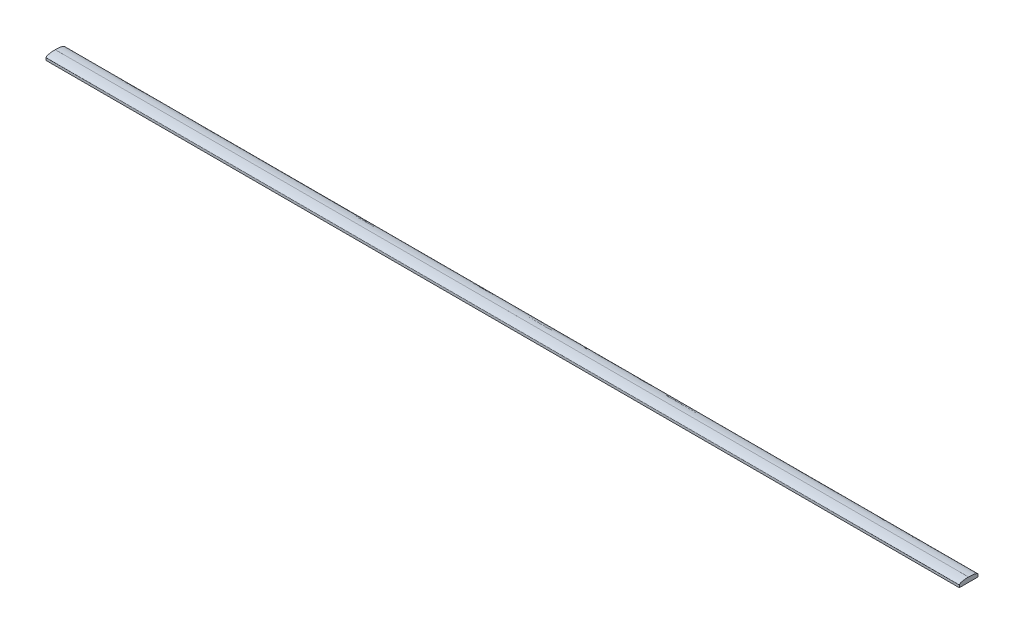
ISO-10303-21;
HEADER;
FILE_DESCRIPTION(('STEP AP214'),'2;1');
FILE_NAME('part.step','',(''),(''),'','','');
FILE_SCHEMA(('AUTOMOTIVE_DESIGN { 1 0 10303 214 1 1 1 1 }'));
ENDSEC;
DATA;
#1=APPLICATION_CONTEXT('core data for automotive mechanical design processes');
#2=APPLICATION_PROTOCOL_DEFINITION('international standard','automotive_design',2000,#1);
#3=PRODUCT_CONTEXT('',#1,'mechanical');
#4=PRODUCT('Part','Part','',(#3));
#5=PRODUCT_RELATED_PRODUCT_CATEGORY('part','',(#4));
#6=PRODUCT_DEFINITION_FORMATION('','',#4);
#7=PRODUCT_DEFINITION_CONTEXT('part definition',#1,'design');
#8=PRODUCT_DEFINITION('design','',#6,#7);
#9=PRODUCT_DEFINITION_SHAPE('','',#8);
#10=(LENGTH_UNIT() NAMED_UNIT(*) SI_UNIT(.MILLI.,.METRE.));
#11=(NAMED_UNIT(*) PLANE_ANGLE_UNIT() SI_UNIT($,.RADIAN.));
#12=(NAMED_UNIT(*) SI_UNIT($,.STERADIAN.) SOLID_ANGLE_UNIT());
#13=UNCERTAINTY_MEASURE_WITH_UNIT(LENGTH_MEASURE(1.E-05),#10,'distance_accuracy_value','');
#14=(GEOMETRIC_REPRESENTATION_CONTEXT(3) GLOBAL_UNCERTAINTY_ASSIGNED_CONTEXT((#13)) GLOBAL_UNIT_ASSIGNED_CONTEXT((#10,
#11,#12)) REPRESENTATION_CONTEXT('',''));
#15=CARTESIAN_POINT('',(0.,0.,0.));
#16=DIRECTION('',(0.,0.,1.));
#17=DIRECTION('',(1.,0.,0.));
#18=AXIS2_PLACEMENT_3D('',#15,#16,#17);
#19=CARTESIAN_POINT('',(0.,2.54,0.));
#20=DIRECTION('',(1.,0.,0.));
#21=DIRECTION('',(0.,0.,-1.));
#22=AXIS2_PLACEMENT_3D('',#19,#20,#21);
#23=PLANE('',#22);
#24=CARTESIAN_POINT('',(0.,1.27,-10.));
#25=CARTESIAN_POINT('',(0.,2.54,-10.));
#26=CARTESIAN_POINT('',(0.,2.54,-4.92));
#27=(BOUNDED_CURVE() B_SPLINE_CURVE(2,(#24,#25,#26),.UNSPECIFIED.,.F.,
.F.) B_SPLINE_CURVE_WITH_KNOTS((3,3),(0.,1.),
.UNSPECIFIED.) CURVE() GEOMETRIC_REPRESENTATION_ITEM() RATIONAL_B_SPLINE_CURVE((1.,
0.707106781186548,1.)) REPRESENTATION_ITEM(''));
#28=CARTESIAN_POINT('',(0.,2.53968508639551,-5.07996825173491));
#29=VERTEX_POINT('',#28);
#30=CARTESIAN_POINT('',(0.,2.54,-4.92000628963513));
#31=VERTEX_POINT('',#30);
#32=EDGE_CURVE('E119',#29,#31,#27,.T.);
#33=ORIENTED_EDGE('',*,*,#32,.F.);
#34=CARTESIAN_POINT('',(0.,1.27,-10.));
#35=CARTESIAN_POINT('',(0.,2.54,-10.));
#36=CARTESIAN_POINT('',(0.,2.54,-4.92));
#37=(BOUNDED_CURVE() B_SPLINE_CURVE(2,(#34,#35,#36),.UNSPECIFIED.,.F.,
.F.) B_SPLINE_CURVE_WITH_KNOTS((3,3),(0.,1.),
.UNSPECIFIED.) CURVE() GEOMETRIC_REPRESENTATION_ITEM() RATIONAL_B_SPLINE_CURVE((1.,
0.707106781186548,1.)) REPRESENTATION_ITEM(''));
#38=CARTESIAN_POINT('',(0.,1.27,-10.));
#39=VERTEX_POINT('',#38);
#40=EDGE_CURVE('E261',#29,#39,#37,.F.);
#41=ORIENTED_EDGE('',*,*,#40,.T.);
#42=DIRECTION('',(0.,-1.,0.));
#43=VECTOR('',#42,1.);
#44=CARTESIAN_POINT('',(0.,2.54,-10.));
#45=LINE('',#44,#43);
#46=CARTESIAN_POINT('',(0.,0.,-10.));
#47=VERTEX_POINT('',#46);
#48=EDGE_CURVE('E268',#39,#47,#45,.T.);
#49=ORIENTED_EDGE('',*,*,#48,.T.);
#50=DIRECTION('',(0.,0.,1.));
#51=VECTOR('',#50,1.);
#52=CARTESIAN_POINT('',(0.,0.,0.));
#53=LINE('',#52,#51);
#54=CARTESIAN_POINT('',(0.,0.,0.));
#55=VERTEX_POINT('',#54);
#56=EDGE_CURVE('E114',#47,#55,#53,.T.);
#57=ORIENTED_EDGE('',*,*,#56,.T.);
#58=DIRECTION('',(0.,-1.,0.));
#59=VECTOR('',#58,1.);
#60=CARTESIAN_POINT('',(0.,2.54,0.));
#61=LINE('',#60,#59);
#62=CARTESIAN_POINT('',(0.,1.27,0.));
#63=VERTEX_POINT('',#62);
#64=EDGE_CURVE('E96',#63,#55,#61,.T.);
#65=ORIENTED_EDGE('',*,*,#64,.F.);
#66=CARTESIAN_POINT('',(0.,2.54,-5.08));
#67=CARTESIAN_POINT('',(0.,2.54,0.));
#68=CARTESIAN_POINT('',(0.,1.27,0.));
#69=(BOUNDED_CURVE() B_SPLINE_CURVE(2,(#66,#67,#68),.UNSPECIFIED.,.F.,
.F.) B_SPLINE_CURVE_WITH_KNOTS((3,3),(0.,1.),
.UNSPECIFIED.) CURVE() GEOMETRIC_REPRESENTATION_ITEM() RATIONAL_B_SPLINE_CURVE((1.,
0.707106781186548,1.)) REPRESENTATION_ITEM(''));
#70=EDGE_CURVE('E188',#63,#31,#69,.F.);
#71=ORIENTED_EDGE('',*,*,#70,.T.);
#72=EDGE_LOOP('',(#33,#41,#49,#57,#65,#71));
#73=FACE_BOUND('',#72,.T.);
#74=ADVANCED_FACE('F38',(#73),#23,.F.);
#75=CARTESIAN_POINT('',(0.,2.54,0.));
#76=DIRECTION('',(0.,0.,-1.));
#77=DIRECTION('',(-1.,0.,0.));
#78=AXIS2_PLACEMENT_3D('',#75,#76,#77);
#79=PLANE('',#78);
#80=DIRECTION('',(0.,-1.,0.));
#81=VECTOR('',#80,1.);
#82=CARTESIAN_POINT('',(488.95,2.54,0.));
#83=LINE('',#82,#81);
#84=CARTESIAN_POINT('',(488.95,1.27,0.));
#85=VERTEX_POINT('',#84);
#86=CARTESIAN_POINT('',(488.95,0.,0.));
#87=VERTEX_POINT('',#86);
#88=EDGE_CURVE('E255',#85,#87,#83,.T.);
#89=ORIENTED_EDGE('',*,*,#88,.F.);
#90=CARTESIAN_POINT('',(-24.4475,1.27,0.));
#91=CARTESIAN_POINT('',(154.834166666667,1.27,0.));
#92=CARTESIAN_POINT('',(334.115833333333,1.27,0.));
#93=CARTESIAN_POINT('',(513.3975,1.27,0.));
#94=(BOUNDED_CURVE() B_SPLINE_CURVE(3,(#90,#91,#92,#93),.UNSPECIFIED.,.F.,
.F.) B_SPLINE_CURVE_WITH_KNOTS((4,4),(-0.0244475,0.5133975),
.UNSPECIFIED.) CURVE() GEOMETRIC_REPRESENTATION_ITEM() RATIONAL_B_SPLINE_CURVE((1.,1.,1.,1.)) REPRESENTATION_ITEM(''));
#95=EDGE_CURVE('E12',#85,#63,#94,.F.);
#96=ORIENTED_EDGE('',*,*,#95,.T.);
#97=ORIENTED_EDGE('',*,*,#64,.T.);
#98=DIRECTION('',(1.,0.,0.));
#99=VECTOR('',#98,1.);
#100=CARTESIAN_POINT('',(0.,0.,0.));
#101=LINE('',#100,#99);
#102=EDGE_CURVE('E301',#55,#87,#101,.T.);
#103=ORIENTED_EDGE('',*,*,#102,.T.);
#104=EDGE_LOOP('',(#89,#96,#97,#103));
#105=FACE_BOUND('',#104,.T.);
#106=ADVANCED_FACE('F229',(#105),#79,.F.);
#107=CARTESIAN_POINT('',(488.95,2.54,0.));
#108=DIRECTION('',(-1.,0.,0.));
#109=DIRECTION('',(0.,0.,1.));
#110=AXIS2_PLACEMENT_3D('',#107,#108,#109);
#111=PLANE('',#110);
#112=DIRECTION('',(0.,-1.,0.));
#113=VECTOR('',#112,1.);
#114=CARTESIAN_POINT('',(488.95,2.54,-10.));
#115=LINE('',#114,#113);
#116=CARTESIAN_POINT('',(488.95,1.27,-10.));
#117=VERTEX_POINT('',#116);
#118=CARTESIAN_POINT('',(488.95,0.,-10.));
#119=VERTEX_POINT('',#118);
#120=EDGE_CURVE('E262',#117,#119,#115,.T.);
#121=ORIENTED_EDGE('',*,*,#120,.F.);
#122=CARTESIAN_POINT('',(488.95,2.54,-4.92));
#123=CARTESIAN_POINT('',(488.95,2.54,-10.));
#124=CARTESIAN_POINT('',(488.95,1.27,-10.));
#125=(BOUNDED_CURVE() B_SPLINE_CURVE(2,(#122,#123,#124),.UNSPECIFIED.,.F.,
.F.) B_SPLINE_CURVE_WITH_KNOTS((3,3),(0.,1.),
.UNSPECIFIED.) CURVE() GEOMETRIC_REPRESENTATION_ITEM() RATIONAL_B_SPLINE_CURVE((1.,
0.707106781186547,1.)) REPRESENTATION_ITEM(''));
#126=CARTESIAN_POINT('',(488.95,2.53968501105831,-5.07998738390612));
#127=VERTEX_POINT('',#126);
#128=EDGE_CURVE('E54',#117,#127,#125,.F.);
#129=ORIENTED_EDGE('',*,*,#128,.T.);
#130=CARTESIAN_POINT('',(488.95,2.54,-4.92));
#131=CARTESIAN_POINT('',(488.95,2.54,-10.));
#132=CARTESIAN_POINT('',(488.95,1.27,-10.));
#133=(BOUNDED_CURVE() B_SPLINE_CURVE(2,(#130,#131,#132),.UNSPECIFIED.,.F.,
.F.) B_SPLINE_CURVE_WITH_KNOTS((3,3),(0.,1.),
.UNSPECIFIED.) CURVE() GEOMETRIC_REPRESENTATION_ITEM() RATIONAL_B_SPLINE_CURVE((1.,
0.707106781186548,1.)) REPRESENTATION_ITEM(''));
#134=CARTESIAN_POINT('',(488.949988987637,2.54,-4.9200000035921));
#135=VERTEX_POINT('',#134);
#136=EDGE_CURVE('E215',#135,#127,#133,.T.);
#137=ORIENTED_EDGE('',*,*,#136,.F.);
#138=CARTESIAN_POINT('',(488.95,1.27,0.));
#139=CARTESIAN_POINT('',(488.95,2.54,0.));
#140=CARTESIAN_POINT('',(488.95,2.54,-5.08));
#141=(BOUNDED_CURVE() B_SPLINE_CURVE(2,(#138,#139,#140),.UNSPECIFIED.,.F.,
.F.) B_SPLINE_CURVE_WITH_KNOTS((3,3),(0.,1.),
.UNSPECIFIED.) CURVE() GEOMETRIC_REPRESENTATION_ITEM() RATIONAL_B_SPLINE_CURVE((1.,
0.707106781186548,1.)) REPRESENTATION_ITEM(''));
#142=EDGE_CURVE('E61',#135,#85,#141,.F.);
#143=ORIENTED_EDGE('',*,*,#142,.T.);
#144=ORIENTED_EDGE('',*,*,#88,.T.);
#145=DIRECTION('',(0.,0.,-1.));
#146=VECTOR('',#145,1.);
#147=CARTESIAN_POINT('',(488.95,0.,0.));
#148=LINE('',#147,#146);
#149=EDGE_CURVE('E298',#87,#119,#148,.T.);
#150=ORIENTED_EDGE('',*,*,#149,.T.);
#151=EDGE_LOOP('',(#121,#129,#137,#143,#144,#150));
#152=FACE_BOUND('',#151,.T.);
#153=ADVANCED_FACE('F219',(#152),#111,.F.);
#154=CARTESIAN_POINT('',(0.,2.54,-10.));
#155=DIRECTION('',(0.,0.,1.));
#156=DIRECTION('',(1.,0.,0.));
#157=AXIS2_PLACEMENT_3D('',#154,#155,#156);
#158=PLANE('',#157);
#159=ORIENTED_EDGE('',*,*,#48,.F.);
#160=CARTESIAN_POINT('',(513.3975,1.27,-10.));
#161=CARTESIAN_POINT('',(334.115833333333,1.27,-10.));
#162=CARTESIAN_POINT('',(154.834166666667,1.27,-10.));
#163=CARTESIAN_POINT('',(-24.4475,1.27,-10.));
#164=(BOUNDED_CURVE() B_SPLINE_CURVE(3,(#160,#161,#162,#163),.UNSPECIFIED.,.F.,
.F.) B_SPLINE_CURVE_WITH_KNOTS((4,4),(-0.5133975,0.0244475),
.UNSPECIFIED.) CURVE() GEOMETRIC_REPRESENTATION_ITEM() RATIONAL_B_SPLINE_CURVE((1.,1.,1.,1.)) REPRESENTATION_ITEM(''));
#165=EDGE_CURVE('E178',#39,#117,#164,.F.);
#166=ORIENTED_EDGE('',*,*,#165,.T.);
#167=ORIENTED_EDGE('',*,*,#120,.T.);
#168=DIRECTION('',(-1.,0.,0.));
#169=VECTOR('',#168,1.);
#170=CARTESIAN_POINT('',(0.,0.,-10.));
#171=LINE('',#170,#169);
#172=EDGE_CURVE('E274',#119,#47,#171,.T.);
#173=ORIENTED_EDGE('',*,*,#172,.T.);
#174=EDGE_LOOP('',(#159,#166,#167,#173));
#175=FACE_BOUND('',#174,.T.);
#176=ADVANCED_FACE('F228',(#175),#158,.F.);
#177=CARTESIAN_POINT('',(0.,0.,0.));
#178=DIRECTION('',(0.,-1.,0.));
#179=DIRECTION('',(0.,0.,-1.));
#180=AXIS2_PLACEMENT_3D('',#177,#178,#179);
#181=PLANE('',#180);
#182=ORIENTED_EDGE('',*,*,#56,.F.);
#183=ORIENTED_EDGE('',*,*,#172,.F.);
#184=ORIENTED_EDGE('',*,*,#149,.F.);
#185=ORIENTED_EDGE('',*,*,#102,.F.);
#186=EDGE_LOOP('',(#182,#183,#184,#185));
#187=FACE_BOUND('',#186,.T.);
#188=ADVANCED_FACE('F302',(#187),#181,.T.);
#189=CARTESIAN_POINT('',(-24.4475,2.54,-5.08));
#190=CARTESIAN_POINT('',(154.834166666667,2.54,-5.08));
#191=CARTESIAN_POINT('',(334.115833333333,2.54,-5.08));
#192=CARTESIAN_POINT('',(513.3975,2.54,-5.08));
#193=CARTESIAN_POINT('',(-24.4475,2.54,0.));
#194=CARTESIAN_POINT('',(154.834166666667,2.54,0.));
#195=CARTESIAN_POINT('',(334.115833333333,2.54,0.));
#196=CARTESIAN_POINT('',(513.3975,2.54,0.));
#197=CARTESIAN_POINT('',(-24.4475,1.27,0.));
#198=CARTESIAN_POINT('',(154.834166666667,1.27,0.));
#199=CARTESIAN_POINT('',(334.115833333333,1.27,0.));
#200=CARTESIAN_POINT('',(513.3975,1.27,0.));
#201=(BOUNDED_SURFACE() B_SPLINE_SURFACE(2,3,((#189,#190,#191,#192),(#193,#194,#195,#196),(#197,
#198,#199,#200)),.UNSPECIFIED.,.F.,.F.,.F.) B_SPLINE_SURFACE_WITH_KNOTS((3,3),(4,4),(0.,1.),
(-0.0244475,0.5133975),
.UNSPECIFIED.) GEOMETRIC_REPRESENTATION_ITEM() RATIONAL_B_SPLINE_SURFACE(((1.,1.,1.,1.),
(0.707106781186548,0.707106781186548,0.707106781186548,0.707106781186548),(1.,1.,1.,1.))) REPRESENTATION_ITEM('') SURFACE());
#202=CARTESIAN_POINT('',(244.475,2.53984250992003,-4.99999999999994));
#203=CARTESIAN_POINT('',(254.661457874061,2.53985567608562,-4.99665620908843));
#204=CARTESIAN_POINT('',(264.847915748545,2.53986801151515,-4.99331370351923));
#205=CARTESIAN_POINT('',(285.220831497514,2.53989102481231,-4.98663127955547));
#206=CARTESIAN_POINT('',(295.407289371998,2.53990170267994,-4.98329136116091));
#207=CARTESIAN_POINT('',(315.780205120966,2.53992140476353,-4.97661412803619));
#208=CARTESIAN_POINT('',(325.96666299545,2.53993042897948,-4.97327681330603));
#209=CARTESIAN_POINT('',(346.339578744418,2.53994682768257,-4.96660480388792));
#210=CARTESIAN_POINT('',(356.526036618903,2.5399542021697,-4.96327010919998));
#211=CARTESIAN_POINT('',(376.898952367871,2.53996730534696,-4.95660335616274));
#212=CARTESIAN_POINT('',(387.085410242355,2.53997303403709,-4.95327129781344));
#213=CARTESIAN_POINT('',(407.458325991323,2.53998284956224,-4.94660983365831));
#214=CARTESIAN_POINT('',(417.644783865808,2.53998693639724,-4.94328042785247));
#215=CARTESIAN_POINT('',(438.017699614776,2.53999347216278,-4.93662428490764));
#216=CARTESIAN_POINT('',(448.20415748926,2.53999592109331,-4.93329754776864));
#217=CARTESIAN_POINT('',(468.577073238229,2.53999918501246,-4.9266467581689));
#218=CARTESIAN_POINT('',(478.763531112713,2.54000000000107,-4.92332270570816));
#219=CARTESIAN_POINT('',(488.949988987637,2.54,-4.9200000035921));
#220=B_SPLINE_CURVE_WITH_KNOTS('',3,(#202,#203,#204,#205,#206,#207,#208,#209,#210,#211,#212,
#213,#214,#215,#216,#217,#218,#219),.UNSPECIFIED.,.F.,.F.,(4,2,2,2,2,2,2,2,4),(0.,
30.5593752686503,61.118750534749,91.6781257982829,122.237501059239,152.796876317603,
183.356251573364,213.915626826507,244.47500207702),.UNSPECIFIED.);
#221=CARTESIAN_POINT('',(244.475,2.53984250992003,-4.99999999999995));
#222=VERTEX_POINT('',#221);
#223=EDGE_CURVE('E102',#222,#135,#220,.T.);
#224=CARTESIAN_POINT('',(0.,2.54,-4.92));
#225=CARTESIAN_POINT('',(10.1864583337731,2.54000000000166,-4.92332270226476));
#226=CARTESIAN_POINT('',(20.3729166671057,2.53999918501356,-4.92664675487432));
#227=CARTESIAN_POINT('',(40.745833333771,2.5399959210953,-4.93329754477195));
#228=CARTESIAN_POINT('',(50.9322916671036,2.53999347216513,-4.93662428206001));
#229=CARTESIAN_POINT('',(71.3052083337689,2.53998693640018,-4.94328042530323));
#230=CARTESIAN_POINT('',(81.4916666671014,2.5399828495654,-4.94660983125838));
#231=CARTESIAN_POINT('',(101.864583333767,2.53997303404056,-4.95327129571239));
#232=CARTESIAN_POINT('',(112.051041667099,2.5399673053505,-4.95660335421124));
#233=CARTESIAN_POINT('',(132.423958333765,2.53995420217324,-4.96327010754784));
#234=CARTESIAN_POINT('',(142.610416667097,2.53994682768604,-4.96660480238557));
#235=CARTESIAN_POINT('',(162.983333333762,2.53993042898266,-4.97327681210351));
#236=CARTESIAN_POINT('',(173.169791667095,2.53992140476648,-4.97661412698371));
#237=CARTESIAN_POINT('',(193.54270833376,2.53990170268231,-4.98329136040874));
#238=CARTESIAN_POINT('',(203.729166667093,2.53989102481431,-4.98663127895357));
#239=CARTESIAN_POINT('',(224.102083333758,2.53986801151627,-4.9933137032181));
#240=CARTESIAN_POINT('',(234.28854166709,2.53985567608622,-4.99665620893781));
#241=CARTESIAN_POINT('',(244.475,2.53984250992003,-4.99999999999994));
#242=B_SPLINE_CURVE_WITH_KNOTS('',3,(#224,#225,#226,#227,#228,#229,#230,#231,#232,#233,#234,
#235,#236,#237,#238,#239,#240,#241),.UNSPECIFIED.,.F.,.F.,(4,2,2,2,2,2,2,2,4),(0.,
30.5593766270583,61.1187532567468,91.6781298890524,122.237506523963,152.796883161464,
183.356259801543,213.915636444187,244.475013089383),.UNSPECIFIED.);
#243=EDGE_CURVE('E107',#31,#222,#242,.T.);
#244=ORIENTED_EDGE('',*,*,#95,.F.);
#245=ORIENTED_EDGE('',*,*,#142,.F.);
#246=ORIENTED_EDGE('',*,*,#223,.F.);
#247=ORIENTED_EDGE('',*,*,#243,.F.);
#248=ORIENTED_EDGE('',*,*,#70,.F.);
#249=EDGE_LOOP('',(#244,#245,#246,#247,#248));
#250=FACE_BOUND('',#249,.T.);
#251=ADVANCED_FACE('F41',(#250),#201,.T.);
#252=CARTESIAN_POINT('',(513.3975,2.54,-4.92));
#253=CARTESIAN_POINT('',(334.115833333333,2.54,-4.92));
#254=CARTESIAN_POINT('',(154.834166666667,2.54,-4.92));
#255=CARTESIAN_POINT('',(-24.4475,2.54,-4.92));
#256=CARTESIAN_POINT('',(513.3975,2.54,-10.));
#257=CARTESIAN_POINT('',(334.115833333333,2.54,-10.));
#258=CARTESIAN_POINT('',(154.834166666667,2.54,-10.));
#259=CARTESIAN_POINT('',(-24.4475,2.54,-10.));
#260=CARTESIAN_POINT('',(513.3975,1.27,-10.));
#261=CARTESIAN_POINT('',(334.115833333333,1.27,-10.));
#262=CARTESIAN_POINT('',(154.834166666667,1.27,-10.));
#263=CARTESIAN_POINT('',(-24.4475,1.27,-10.));
#264=(BOUNDED_SURFACE() B_SPLINE_SURFACE(2,3,((#252,#253,#254,#255),(#256,#257,#258,#259),(#260,
#261,#262,#263)),.UNSPECIFIED.,.F.,.F.,.F.) B_SPLINE_SURFACE_WITH_KNOTS((3,3),(4,4),(0.,1.),
(-0.5133975,0.0244475),
.UNSPECIFIED.) GEOMETRIC_REPRESENTATION_ITEM() RATIONAL_B_SPLINE_SURFACE(((1.,1.,1.,1.),
(0.707106781186548,0.707106781186548,0.707106781186548,0.707106781186548),(1.,1.,1.,1.))) REPRESENTATION_ITEM('') SURFACE());
#265=ORIENTED_EDGE('',*,*,#128,.F.);
#266=ORIENTED_EDGE('',*,*,#165,.F.);
#267=ORIENTED_EDGE('',*,*,#40,.F.);
#268=ORIENTED_EDGE('',*,*,#32,.T.);
#269=ORIENTED_EDGE('',*,*,#243,.T.);
#270=ORIENTED_EDGE('',*,*,#223,.T.);
#271=ORIENTED_EDGE('',*,*,#136,.T.);
#272=EDGE_LOOP('',(#265,#266,#267,#268,#269,#270,#271));
#273=FACE_BOUND('',#272,.T.);
#274=ADVANCED_FACE('F117',(#273),#264,.T.);
#275=CLOSED_SHELL('',(#74,#106,#153,#176,#188,#251,#274));
#276=MANIFOLD_SOLID_BREP('B2',#275);
#277=ADVANCED_BREP_SHAPE_REPRESENTATION('',(#18,#276),#14);
#278=SHAPE_DEFINITION_REPRESENTATION(#9,#277);
ENDSEC;
END-ISO-10303-21;
